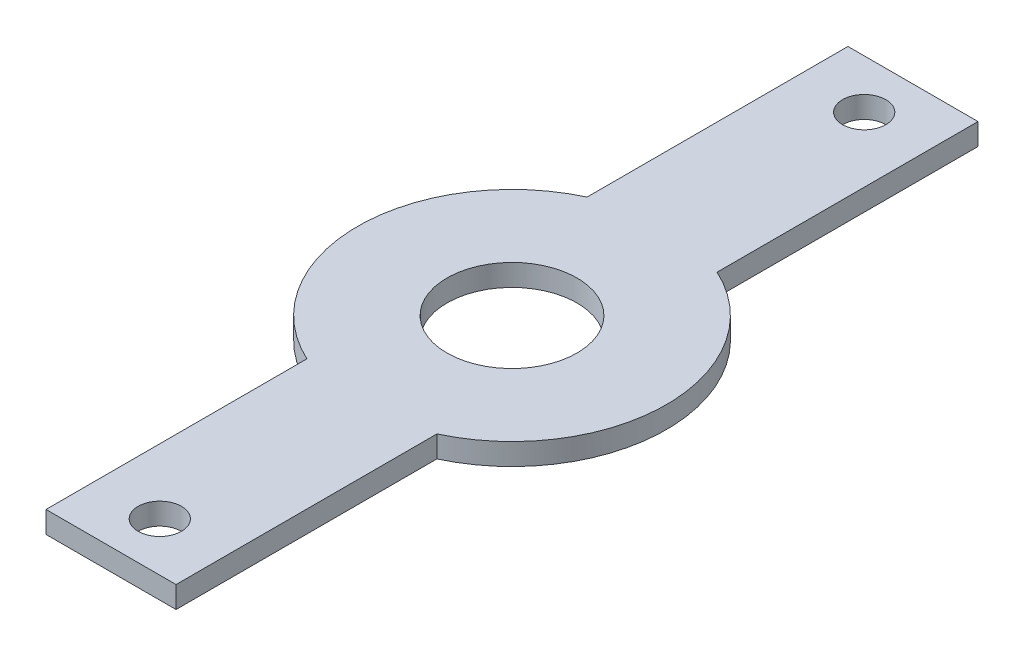
ISO-10303-21;
HEADER;
FILE_DESCRIPTION(('STEP AP214'),'2;1');
FILE_NAME('part.step','',(''),(''),'','','');
FILE_SCHEMA(('AUTOMOTIVE_DESIGN { 1 0 10303 214 1 1 1 1 }'));
ENDSEC;
DATA;
#1=APPLICATION_CONTEXT('core data for automotive mechanical design processes');
#2=APPLICATION_PROTOCOL_DEFINITION('international standard','automotive_design',2000,#1);
#3=PRODUCT_CONTEXT('',#1,'mechanical');
#4=PRODUCT('Part','Part','',(#3));
#5=PRODUCT_RELATED_PRODUCT_CATEGORY('part','',(#4));
#6=PRODUCT_DEFINITION_FORMATION('','',#4);
#7=PRODUCT_DEFINITION_CONTEXT('part definition',#1,'design');
#8=PRODUCT_DEFINITION('design','',#6,#7);
#9=PRODUCT_DEFINITION_SHAPE('','',#8);
#10=(LENGTH_UNIT() NAMED_UNIT(*) SI_UNIT(.MILLI.,.METRE.));
#11=(NAMED_UNIT(*) PLANE_ANGLE_UNIT() SI_UNIT($,.RADIAN.));
#12=(NAMED_UNIT(*) SI_UNIT($,.STERADIAN.) SOLID_ANGLE_UNIT());
#13=UNCERTAINTY_MEASURE_WITH_UNIT(LENGTH_MEASURE(1.E-05),#10,'distance_accuracy_value','');
#14=(GEOMETRIC_REPRESENTATION_CONTEXT(3) GLOBAL_UNCERTAINTY_ASSIGNED_CONTEXT((#13)) GLOBAL_UNIT_ASSIGNED_CONTEXT((#10,
#11,#12)) REPRESENTATION_CONTEXT('',''));
#15=CARTESIAN_POINT('',(0.,0.,0.));
#16=DIRECTION('',(0.,0.,1.));
#17=DIRECTION('',(1.,0.,0.));
#18=AXIS2_PLACEMENT_3D('',#15,#16,#17);
#19=CARTESIAN_POINT('',(0.,2.,0.));
#20=DIRECTION('',(0.,1.,0.));
#21=DIRECTION('',(0.,0.,1.));
#22=AXIS2_PLACEMENT_3D('',#19,#20,#21);
#23=PLANE('',#22);
#24=CARTESIAN_POINT('',(0.,2.,0.));
#25=DIRECTION('',(0.,1.,0.));
#26=DIRECTION('',(0.,0.,1.));
#27=AXIS2_PLACEMENT_3D('',#24,#25,#26);
#28=CIRCLE('',#27,6.);
#29=CARTESIAN_POINT('',(0.,2.,6.));
#30=VERTEX_POINT('',#29);
#31=EDGE_CURVE('E228',#30,#30,#28,.T.);
#32=ORIENTED_EDGE('',*,*,#31,.F.);
#33=EDGE_LOOP('',(#32));
#34=FACE_BOUND('',#33,.T.);
#35=CARTESIAN_POINT('',(0.,2.,-32.5));
#36=DIRECTION('',(0.,1.,0.));
#37=DIRECTION('',(0.,0.,1.));
#38=AXIS2_PLACEMENT_3D('',#35,#36,#37);
#39=CIRCLE('',#38,2.);
#40=CARTESIAN_POINT('',(0.,2.,-30.5));
#41=VERTEX_POINT('',#40);
#42=EDGE_CURVE('E146',#41,#41,#39,.T.);
#43=ORIENTED_EDGE('',*,*,#42,.F.);
#44=EDGE_LOOP('',(#43));
#45=FACE_BOUND('',#44,.T.);
#46=DIRECTION('',(0.,0.,1.));
#47=VECTOR('',#46,1.);
#48=CARTESIAN_POINT('',(-6.,2.,-37.));
#49=LINE('',#48,#47);
#50=CARTESIAN_POINT('',(-6.,2.,-37.));
#51=VERTEX_POINT('',#50);
#52=CARTESIAN_POINT('',(-6.,2.,-12.9252659547106));
#53=VERTEX_POINT('',#52);
#54=EDGE_CURVE('E164',#51,#53,#49,.T.);
#55=ORIENTED_EDGE('',*,*,#54,.T.);
#56=CARTESIAN_POINT('',(0.,2.,0.));
#57=DIRECTION('',(0.,1.,0.));
#58=DIRECTION('',(0.,0.,1.));
#59=AXIS2_PLACEMENT_3D('',#56,#57,#58);
#60=CIRCLE('',#59,14.25);
#61=CARTESIAN_POINT('',(-6.,2.,12.9252659547106));
#62=VERTEX_POINT('',#61);
#63=EDGE_CURVE('E100',#53,#62,#60,.T.);
#64=ORIENTED_EDGE('',*,*,#63,.T.);
#65=DIRECTION('',(0.,0.,1.));
#66=VECTOR('',#65,1.);
#67=CARTESIAN_POINT('',(-6.,2.,37.));
#68=LINE('',#67,#66);
#69=CARTESIAN_POINT('',(-6.,2.,37.));
#70=VERTEX_POINT('',#69);
#71=EDGE_CURVE('E185',#62,#70,#68,.T.);
#72=ORIENTED_EDGE('',*,*,#71,.T.);
#73=DIRECTION('',(1.,0.,0.));
#74=VECTOR('',#73,1.);
#75=CARTESIAN_POINT('',(-6.,2.,37.));
#76=LINE('',#75,#74);
#77=CARTESIAN_POINT('',(6.,2.,37.));
#78=VERTEX_POINT('',#77);
#79=EDGE_CURVE('E199',#70,#78,#76,.T.);
#80=ORIENTED_EDGE('',*,*,#79,.T.);
#81=DIRECTION('',(0.,0.,-1.));
#82=VECTOR('',#81,1.);
#83=CARTESIAN_POINT('',(6.,2.,37.));
#84=LINE('',#83,#82);
#85=CARTESIAN_POINT('',(6.,2.,12.9252659547106));
#86=VERTEX_POINT('',#85);
#87=EDGE_CURVE('E119',#78,#86,#84,.T.);
#88=ORIENTED_EDGE('',*,*,#87,.T.);
#89=CARTESIAN_POINT('',(0.,2.,0.));
#90=DIRECTION('',(0.,1.,0.));
#91=DIRECTION('',(0.,0.,1.));
#92=AXIS2_PLACEMENT_3D('',#89,#90,#91);
#93=CIRCLE('',#92,14.25);
#94=CARTESIAN_POINT('',(6.,2.,-12.9252659547106));
#95=VERTEX_POINT('',#94);
#96=EDGE_CURVE('E113',#86,#95,#93,.T.);
#97=ORIENTED_EDGE('',*,*,#96,.T.);
#98=DIRECTION('',(0.,0.,-1.));
#99=VECTOR('',#98,1.);
#100=CARTESIAN_POINT('',(6.,2.,-37.));
#101=LINE('',#100,#99);
#102=CARTESIAN_POINT('',(6.,2.,-37.));
#103=VERTEX_POINT('',#102);
#104=EDGE_CURVE('E117',#95,#103,#101,.T.);
#105=ORIENTED_EDGE('',*,*,#104,.T.);
#106=DIRECTION('',(-1.,0.,0.));
#107=VECTOR('',#106,1.);
#108=CARTESIAN_POINT('',(-6.,2.,-37.));
#109=LINE('',#108,#107);
#110=EDGE_CURVE('E57',#103,#51,#109,.T.);
#111=ORIENTED_EDGE('',*,*,#110,.T.);
#112=EDGE_LOOP('',(#55,#64,#72,#80,#88,#97,#105,#111));
#113=FACE_BOUND('',#112,.T.);
#114=CARTESIAN_POINT('',(0.,2.,32.5));
#115=DIRECTION('',(0.,1.,0.));
#116=DIRECTION('',(0.,0.,-1.));
#117=AXIS2_PLACEMENT_3D('',#114,#115,#116);
#118=CIRCLE('',#117,2.);
#119=CARTESIAN_POINT('',(0.,2.,30.5));
#120=VERTEX_POINT('',#119);
#121=EDGE_CURVE('E213',#120,#120,#118,.T.);
#122=ORIENTED_EDGE('',*,*,#121,.F.);
#123=EDGE_LOOP('',(#122));
#124=FACE_BOUND('',#123,.T.);
#125=ADVANCED_FACE('F39',(#34,#45,#113,#124),#23,.T.);
#126=CARTESIAN_POINT('',(0.,0.,0.));
#127=DIRECTION('',(0.,1.,0.));
#128=DIRECTION('',(0.,0.,1.));
#129=AXIS2_PLACEMENT_3D('',#126,#127,#128);
#130=PLANE('',#129);
#131=CARTESIAN_POINT('',(0.,0.,0.));
#132=DIRECTION('',(0.,1.,0.));
#133=DIRECTION('',(0.,0.,1.));
#134=AXIS2_PLACEMENT_3D('',#131,#132,#133);
#135=CIRCLE('',#134,6.);
#136=CARTESIAN_POINT('',(0.,0.,6.));
#137=VERTEX_POINT('',#136);
#138=EDGE_CURVE('E221',#137,#137,#135,.F.);
#139=ORIENTED_EDGE('',*,*,#138,.F.);
#140=EDGE_LOOP('',(#139));
#141=FACE_BOUND('',#140,.T.);
#142=DIRECTION('',(0.,0.,1.));
#143=VECTOR('',#142,1.);
#144=CARTESIAN_POINT('',(-6.,0.,-37.));
#145=LINE('',#144,#143);
#146=CARTESIAN_POINT('',(-6.,0.,-37.));
#147=VERTEX_POINT('',#146);
#148=CARTESIAN_POINT('',(-6.,0.,-12.9252659547106));
#149=VERTEX_POINT('',#148);
#150=EDGE_CURVE('E141',#147,#149,#145,.T.);
#151=ORIENTED_EDGE('',*,*,#150,.F.);
#152=DIRECTION('',(-1.,0.,0.));
#153=VECTOR('',#152,1.);
#154=CARTESIAN_POINT('',(-6.,0.,-37.));
#155=LINE('',#154,#153);
#156=CARTESIAN_POINT('',(6.,0.,-37.));
#157=VERTEX_POINT('',#156);
#158=EDGE_CURVE('E92',#157,#147,#155,.T.);
#159=ORIENTED_EDGE('',*,*,#158,.F.);
#160=DIRECTION('',(0.,0.,-1.));
#161=VECTOR('',#160,1.);
#162=CARTESIAN_POINT('',(6.,0.,-37.));
#163=LINE('',#162,#161);
#164=CARTESIAN_POINT('',(6.,0.,-12.9252659547106));
#165=VERTEX_POINT('',#164);
#166=EDGE_CURVE('E86',#165,#157,#163,.T.);
#167=ORIENTED_EDGE('',*,*,#166,.F.);
#168=CARTESIAN_POINT('',(0.,0.,0.));
#169=DIRECTION('',(0.,1.,0.));
#170=DIRECTION('',(0.,0.,1.));
#171=AXIS2_PLACEMENT_3D('',#168,#169,#170);
#172=CIRCLE('',#171,14.25);
#173=CARTESIAN_POINT('',(6.,0.,12.9252659547106));
#174=VERTEX_POINT('',#173);
#175=EDGE_CURVE('E128',#174,#165,#172,.T.);
#176=ORIENTED_EDGE('',*,*,#175,.F.);
#177=DIRECTION('',(0.,0.,-1.));
#178=VECTOR('',#177,1.);
#179=CARTESIAN_POINT('',(6.,0.,37.));
#180=LINE('',#179,#178);
#181=CARTESIAN_POINT('',(6.,0.,37.));
#182=VERTEX_POINT('',#181);
#183=EDGE_CURVE('E155',#182,#174,#180,.T.);
#184=ORIENTED_EDGE('',*,*,#183,.F.);
#185=DIRECTION('',(1.,0.,0.));
#186=VECTOR('',#185,1.);
#187=CARTESIAN_POINT('',(-6.,0.,37.));
#188=LINE('',#187,#186);
#189=CARTESIAN_POINT('',(-6.,0.,37.));
#190=VERTEX_POINT('',#189);
#191=EDGE_CURVE('E152',#190,#182,#188,.T.);
#192=ORIENTED_EDGE('',*,*,#191,.F.);
#193=DIRECTION('',(0.,0.,1.));
#194=VECTOR('',#193,1.);
#195=CARTESIAN_POINT('',(-6.,0.,37.));
#196=LINE('',#195,#194);
#197=CARTESIAN_POINT('',(-6.,0.,12.9252659547106));
#198=VERTEX_POINT('',#197);
#199=EDGE_CURVE('E149',#198,#190,#196,.T.);
#200=ORIENTED_EDGE('',*,*,#199,.F.);
#201=CARTESIAN_POINT('',(0.,0.,0.));
#202=DIRECTION('',(0.,1.,0.));
#203=DIRECTION('',(0.,0.,1.));
#204=AXIS2_PLACEMENT_3D('',#201,#202,#203);
#205=CIRCLE('',#204,14.25);
#206=EDGE_CURVE('E145',#149,#198,#205,.T.);
#207=ORIENTED_EDGE('',*,*,#206,.F.);
#208=EDGE_LOOP('',(#151,#159,#167,#176,#184,#192,#200,#207));
#209=FACE_BOUND('',#208,.T.);
#210=CARTESIAN_POINT('',(0.,0.,-32.5));
#211=DIRECTION('',(0.,1.,0.));
#212=DIRECTION('',(0.,0.,1.));
#213=AXIS2_PLACEMENT_3D('',#210,#211,#212);
#214=CIRCLE('',#213,2.);
#215=CARTESIAN_POINT('',(0.,0.,-30.5));
#216=VERTEX_POINT('',#215);
#217=EDGE_CURVE('E209',#216,#216,#214,.T.);
#218=ORIENTED_EDGE('',*,*,#217,.T.);
#219=EDGE_LOOP('',(#218));
#220=FACE_BOUND('',#219,.T.);
#221=CARTESIAN_POINT('',(0.,0.,32.5));
#222=DIRECTION('',(0.,1.,0.));
#223=DIRECTION('',(0.,0.,-1.));
#224=AXIS2_PLACEMENT_3D('',#221,#222,#223);
#225=CIRCLE('',#224,2.);
#226=CARTESIAN_POINT('',(0.,0.,30.5));
#227=VERTEX_POINT('',#226);
#228=EDGE_CURVE('E217',#227,#227,#225,.T.);
#229=ORIENTED_EDGE('',*,*,#228,.T.);
#230=EDGE_LOOP('',(#229));
#231=FACE_BOUND('',#230,.T.);
#232=ADVANCED_FACE('F189',(#141,#209,#220,#231),#130,.F.);
#233=CARTESIAN_POINT('',(-6.,2.,-37.));
#234=DIRECTION('',(1.,0.,0.));
#235=DIRECTION('',(0.,0.,-1.));
#236=AXIS2_PLACEMENT_3D('',#233,#234,#235);
#237=PLANE('',#236);
#238=ORIENTED_EDGE('',*,*,#150,.T.);
#239=DIRECTION('',(0.,-1.,0.));
#240=VECTOR('',#239,1.);
#241=CARTESIAN_POINT('',(-6.,2.,-12.9252659547106));
#242=LINE('',#241,#240);
#243=EDGE_CURVE('E11',#53,#149,#242,.T.);
#244=ORIENTED_EDGE('',*,*,#243,.F.);
#245=ORIENTED_EDGE('',*,*,#54,.F.);
#246=DIRECTION('',(0.,-1.,0.));
#247=VECTOR('',#246,1.);
#248=CARTESIAN_POINT('',(-6.,2.,-37.));
#249=LINE('',#248,#247);
#250=EDGE_CURVE('E137',#51,#147,#249,.T.);
#251=ORIENTED_EDGE('',*,*,#250,.T.);
#252=EDGE_LOOP('',(#238,#244,#245,#251));
#253=FACE_BOUND('',#252,.T.);
#254=ADVANCED_FACE('F41',(#253),#237,.F.);
#255=CARTESIAN_POINT('',(0.,2.,0.));
#256=DIRECTION('',(0.,-1.,0.));
#257=DIRECTION('',(0.,0.,-1.));
#258=AXIS2_PLACEMENT_3D('',#255,#256,#257);
#259=CYLINDRICAL_SURFACE('',#258,14.25);
#260=ORIENTED_EDGE('',*,*,#206,.T.);
#261=DIRECTION('',(0.,-1.,0.));
#262=VECTOR('',#261,1.);
#263=CARTESIAN_POINT('',(-6.,2.,12.9252659547106));
#264=LINE('',#263,#262);
#265=EDGE_CURVE('E49',#62,#198,#264,.T.);
#266=ORIENTED_EDGE('',*,*,#265,.F.);
#267=ORIENTED_EDGE('',*,*,#63,.F.);
#268=ORIENTED_EDGE('',*,*,#243,.T.);
#269=EDGE_LOOP('',(#260,#266,#267,#268));
#270=FACE_BOUND('',#269,.T.);
#271=ADVANCED_FACE('F273',(#270),#259,.T.);
#272=CARTESIAN_POINT('',(-6.,2.,37.));
#273=DIRECTION('',(1.,0.,0.));
#274=DIRECTION('',(0.,0.,-1.));
#275=AXIS2_PLACEMENT_3D('',#272,#273,#274);
#276=PLANE('',#275);
#277=ORIENTED_EDGE('',*,*,#199,.T.);
#278=DIRECTION('',(0.,-1.,0.));
#279=VECTOR('',#278,1.);
#280=CARTESIAN_POINT('',(-6.,2.,37.));
#281=LINE('',#280,#279);
#282=EDGE_CURVE('E175',#70,#190,#281,.T.);
#283=ORIENTED_EDGE('',*,*,#282,.F.);
#284=ORIENTED_EDGE('',*,*,#71,.F.);
#285=ORIENTED_EDGE('',*,*,#265,.T.);
#286=EDGE_LOOP('',(#277,#283,#284,#285));
#287=FACE_BOUND('',#286,.T.);
#288=ADVANCED_FACE('F183',(#287),#276,.F.);
#289=CARTESIAN_POINT('',(-6.,2.,37.));
#290=DIRECTION('',(0.,0.,-1.));
#291=DIRECTION('',(-1.,0.,0.));
#292=AXIS2_PLACEMENT_3D('',#289,#290,#291);
#293=PLANE('',#292);
#294=ORIENTED_EDGE('',*,*,#191,.T.);
#295=DIRECTION('',(0.,-1.,0.));
#296=VECTOR('',#295,1.);
#297=CARTESIAN_POINT('',(6.,2.,37.));
#298=LINE('',#297,#296);
#299=EDGE_CURVE('E171',#78,#182,#298,.T.);
#300=ORIENTED_EDGE('',*,*,#299,.F.);
#301=ORIENTED_EDGE('',*,*,#79,.F.);
#302=ORIENTED_EDGE('',*,*,#282,.T.);
#303=EDGE_LOOP('',(#294,#300,#301,#302));
#304=FACE_BOUND('',#303,.T.);
#305=ADVANCED_FACE('F194',(#304),#293,.F.);
#306=CARTESIAN_POINT('',(6.,2.,37.));
#307=DIRECTION('',(-1.,0.,0.));
#308=DIRECTION('',(0.,0.,1.));
#309=AXIS2_PLACEMENT_3D('',#306,#307,#308);
#310=PLANE('',#309);
#311=ORIENTED_EDGE('',*,*,#183,.T.);
#312=DIRECTION('',(0.,-1.,0.));
#313=VECTOR('',#312,1.);
#314=CARTESIAN_POINT('',(6.,2.,12.9252659547106));
#315=LINE('',#314,#313);
#316=EDGE_CURVE('E130',#86,#174,#315,.T.);
#317=ORIENTED_EDGE('',*,*,#316,.F.);
#318=ORIENTED_EDGE('',*,*,#87,.F.);
#319=ORIENTED_EDGE('',*,*,#299,.T.);
#320=EDGE_LOOP('',(#311,#317,#318,#319));
#321=FACE_BOUND('',#320,.T.);
#322=ADVANCED_FACE('F197',(#321),#310,.F.);
#323=CARTESIAN_POINT('',(0.,2.,0.));
#324=DIRECTION('',(0.,-1.,0.));
#325=DIRECTION('',(0.,0.,-1.));
#326=AXIS2_PLACEMENT_3D('',#323,#324,#325);
#327=CYLINDRICAL_SURFACE('',#326,14.25);
#328=ORIENTED_EDGE('',*,*,#175,.T.);
#329=DIRECTION('',(0.,-1.,0.));
#330=VECTOR('',#329,1.);
#331=CARTESIAN_POINT('',(6.,2.,-12.9252659547106));
#332=LINE('',#331,#330);
#333=EDGE_CURVE('E125',#95,#165,#332,.T.);
#334=ORIENTED_EDGE('',*,*,#333,.F.);
#335=ORIENTED_EDGE('',*,*,#96,.F.);
#336=ORIENTED_EDGE('',*,*,#316,.T.);
#337=EDGE_LOOP('',(#328,#334,#335,#336));
#338=FACE_BOUND('',#337,.T.);
#339=ADVANCED_FACE('F126',(#338),#327,.T.);
#340=CARTESIAN_POINT('',(6.,2.,-37.));
#341=DIRECTION('',(-1.,0.,0.));
#342=DIRECTION('',(0.,0.,1.));
#343=AXIS2_PLACEMENT_3D('',#340,#341,#342);
#344=PLANE('',#343);
#345=ORIENTED_EDGE('',*,*,#166,.T.);
#346=DIRECTION('',(0.,-1.,0.));
#347=VECTOR('',#346,1.);
#348=CARTESIAN_POINT('',(6.,2.,-37.));
#349=LINE('',#348,#347);
#350=EDGE_CURVE('E131',#103,#157,#349,.T.);
#351=ORIENTED_EDGE('',*,*,#350,.F.);
#352=ORIENTED_EDGE('',*,*,#104,.F.);
#353=ORIENTED_EDGE('',*,*,#333,.T.);
#354=EDGE_LOOP('',(#345,#351,#352,#353));
#355=FACE_BOUND('',#354,.T.);
#356=ADVANCED_FACE('F133',(#355),#344,.F.);
#357=CARTESIAN_POINT('',(-6.,2.,-37.));
#358=DIRECTION('',(0.,0.,1.));
#359=DIRECTION('',(1.,0.,0.));
#360=AXIS2_PLACEMENT_3D('',#357,#358,#359);
#361=PLANE('',#360);
#362=ORIENTED_EDGE('',*,*,#158,.T.);
#363=ORIENTED_EDGE('',*,*,#250,.F.);
#364=ORIENTED_EDGE('',*,*,#110,.F.);
#365=ORIENTED_EDGE('',*,*,#350,.T.);
#366=EDGE_LOOP('',(#362,#363,#364,#365));
#367=FACE_BOUND('',#366,.T.);
#368=ADVANCED_FACE('F245',(#367),#361,.F.);
#369=CARTESIAN_POINT('',(0.,2.,-32.5));
#370=DIRECTION('',(0.,-1.,0.));
#371=DIRECTION('',(0.,0.,-1.));
#372=AXIS2_PLACEMENT_3D('',#369,#370,#371);
#373=CYLINDRICAL_SURFACE('',#372,2.);
#374=ORIENTED_EDGE('',*,*,#42,.T.);
#375=EDGE_LOOP('',(#374));
#376=FACE_BOUND('',#375,.T.);
#377=ORIENTED_EDGE('',*,*,#217,.F.);
#378=EDGE_LOOP('',(#377));
#379=FACE_BOUND('',#378,.T.);
#380=ADVANCED_FACE('F241',(#376,#379),#373,.F.);
#381=CARTESIAN_POINT('',(0.,2.,32.5));
#382=DIRECTION('',(0.,-1.,0.));
#383=DIRECTION('',(0.,0.,-1.));
#384=AXIS2_PLACEMENT_3D('',#381,#382,#383);
#385=CYLINDRICAL_SURFACE('',#384,2.);
#386=ORIENTED_EDGE('',*,*,#121,.T.);
#387=EDGE_LOOP('',(#386));
#388=FACE_BOUND('',#387,.T.);
#389=ORIENTED_EDGE('',*,*,#228,.F.);
#390=EDGE_LOOP('',(#389));
#391=FACE_BOUND('',#390,.T.);
#392=ADVANCED_FACE('F244',(#388,#391),#385,.F.);
#393=CARTESIAN_POINT('',(0.,-0.00100000000000013,0.));
#394=DIRECTION('',(0.,1.,0.));
#395=DIRECTION('',(0.,0.,1.));
#396=AXIS2_PLACEMENT_3D('',#393,#394,#395);
#397=CYLINDRICAL_SURFACE('',#396,6.);
#398=ORIENTED_EDGE('',*,*,#31,.T.);
#399=EDGE_LOOP('',(#398));
#400=FACE_BOUND('',#399,.T.);
#401=ORIENTED_EDGE('',*,*,#138,.T.);
#402=EDGE_LOOP('',(#401));
#403=FACE_BOUND('',#402,.T.);
#404=ADVANCED_FACE('F233',(#400,#403),#397,.F.);
#405=CLOSED_SHELL('',(#125,#232,#254,#271,#288,#305,#322,#339,#356,#368,#380,#392,#404));
#406=MANIFOLD_SOLID_BREP('B2',#405);
#407=ADVANCED_BREP_SHAPE_REPRESENTATION('',(#18,#406),#14);
#408=SHAPE_DEFINITION_REPRESENTATION(#9,#407);
ENDSEC;
END-ISO-10303-21;
